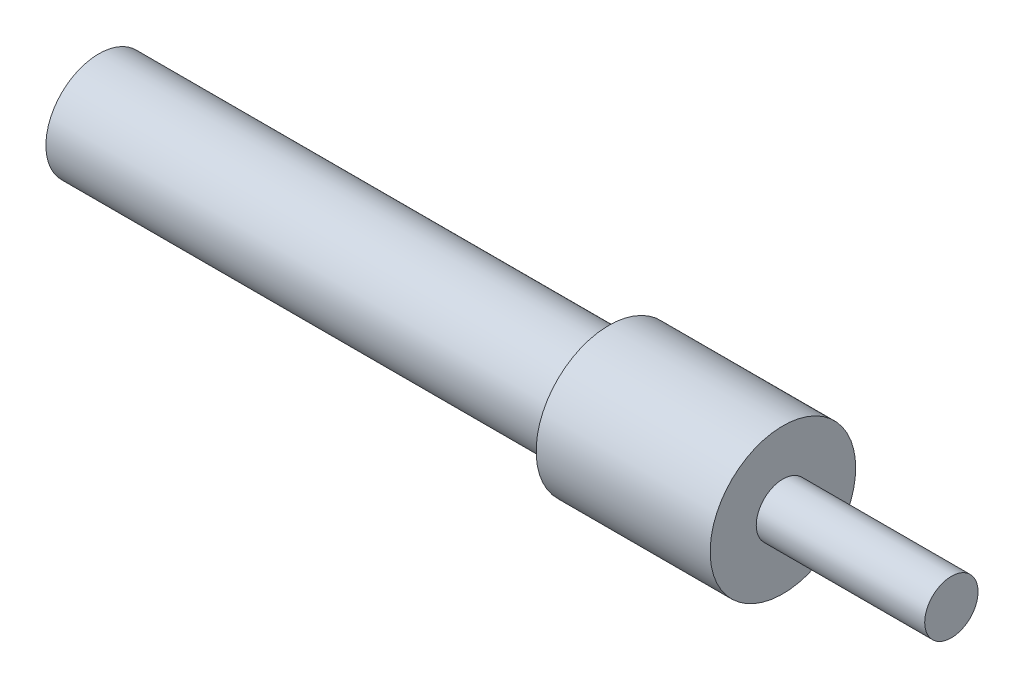
ISO-10303-21;
HEADER;
FILE_DESCRIPTION(('STEP AP214'),'2;1');
FILE_NAME('part.step','',(''),(''),'','','');
FILE_SCHEMA(('AUTOMOTIVE_DESIGN { 1 0 10303 214 1 1 1 1 }'));
ENDSEC;
DATA;
#1=APPLICATION_CONTEXT('core data for automotive mechanical design processes');
#2=APPLICATION_PROTOCOL_DEFINITION('international standard','automotive_design',2000,#1);
#3=PRODUCT_CONTEXT('',#1,'mechanical');
#4=PRODUCT('Part','Part','',(#3));
#5=PRODUCT_RELATED_PRODUCT_CATEGORY('part','',(#4));
#6=PRODUCT_DEFINITION_FORMATION('','',#4);
#7=PRODUCT_DEFINITION_CONTEXT('part definition',#1,'design');
#8=PRODUCT_DEFINITION('design','',#6,#7);
#9=PRODUCT_DEFINITION_SHAPE('','',#8);
#10=(LENGTH_UNIT() NAMED_UNIT(*) SI_UNIT(.MILLI.,.METRE.));
#11=(NAMED_UNIT(*) PLANE_ANGLE_UNIT() SI_UNIT($,.RADIAN.));
#12=(NAMED_UNIT(*) SI_UNIT($,.STERADIAN.) SOLID_ANGLE_UNIT());
#13=UNCERTAINTY_MEASURE_WITH_UNIT(LENGTH_MEASURE(1.E-05),#10,'distance_accuracy_value','');
#14=(GEOMETRIC_REPRESENTATION_CONTEXT(3) GLOBAL_UNCERTAINTY_ASSIGNED_CONTEXT((#13)) GLOBAL_UNIT_ASSIGNED_CONTEXT((#10,
#11,#12)) REPRESENTATION_CONTEXT('',''));
#15=CARTESIAN_POINT('',(0.,0.,0.));
#16=DIRECTION('',(0.,0.,1.));
#17=DIRECTION('',(1.,0.,0.));
#18=AXIS2_PLACEMENT_3D('',#15,#16,#17);
#19=CARTESIAN_POINT('',(15.494,0.,0.));
#20=DIRECTION('',(-1.,0.,0.));
#21=DIRECTION('',(0.,0.,1.));
#22=AXIS2_PLACEMENT_3D('',#19,#20,#21);
#23=CYLINDRICAL_SURFACE('',#22,6.48);
#24=CARTESIAN_POINT('',(15.494,0.,0.));
#25=DIRECTION('',(1.,0.,0.));
#26=DIRECTION('',(0.,0.,-1.));
#27=AXIS2_PLACEMENT_3D('',#24,#25,#26);
#28=CIRCLE('',#27,6.48);
#29=CARTESIAN_POINT('',(15.494,0.,-6.48));
#30=VERTEX_POINT('',#29);
#31=EDGE_CURVE('E10',#30,#30,#28,.T.);
#32=ORIENTED_EDGE('',*,*,#31,.F.);
#33=EDGE_LOOP('',(#32));
#34=FACE_BOUND('',#33,.T.);
#35=CARTESIAN_POINT('',(0.,0.,0.));
#36=DIRECTION('',(1.,0.,0.));
#37=DIRECTION('',(0.,0.,-1.));
#38=AXIS2_PLACEMENT_3D('',#35,#36,#37);
#39=CIRCLE('',#38,6.48);
#40=CARTESIAN_POINT('',(0.,0.,-6.48));
#41=VERTEX_POINT('',#40);
#42=EDGE_CURVE('E44',#41,#41,#39,.T.);
#43=ORIENTED_EDGE('',*,*,#42,.T.);
#44=EDGE_LOOP('',(#43));
#45=FACE_BOUND('',#44,.T.);
#46=ADVANCED_FACE('F37',(#34,#45),#23,.T.);
#47=CARTESIAN_POINT('',(15.494,0.,0.));
#48=DIRECTION('',(1.,0.,0.));
#49=DIRECTION('',(0.,0.,-1.));
#50=AXIS2_PLACEMENT_3D('',#47,#48,#49);
#51=PLANE('',#50);
#52=CARTESIAN_POINT('',(15.494,0.,0.));
#53=DIRECTION('',(-1.,0.,0.));
#54=DIRECTION('',(0.,0.,1.));
#55=AXIS2_PLACEMENT_3D('',#52,#53,#54);
#56=CIRCLE('',#55,2.375);
#57=CARTESIAN_POINT('',(15.494,0.,2.375));
#58=VERTEX_POINT('',#57);
#59=EDGE_CURVE('E54',#58,#58,#56,.T.);
#60=ORIENTED_EDGE('',*,*,#59,.T.);
#61=EDGE_LOOP('',(#60));
#62=FACE_BOUND('',#61,.T.);
#63=ORIENTED_EDGE('',*,*,#31,.T.);
#64=EDGE_LOOP('',(#63));
#65=FACE_BOUND('',#64,.T.);
#66=ADVANCED_FACE('F72',(#62,#65),#51,.T.);
#67=CARTESIAN_POINT('',(0.,0.,0.));
#68=DIRECTION('',(1.,0.,0.));
#69=DIRECTION('',(0.,0.,-1.));
#70=AXIS2_PLACEMENT_3D('',#67,#68,#69);
#71=PLANE('',#70);
#72=CARTESIAN_POINT('',(0.,0.,0.));
#73=DIRECTION('',(1.,0.,0.));
#74=DIRECTION('',(0.,0.,-1.));
#75=AXIS2_PLACEMENT_3D('',#72,#73,#74);
#76=CIRCLE('',#75,4.715);
#77=CARTESIAN_POINT('',(0.,0.,-4.715));
#78=VERTEX_POINT('',#77);
#79=EDGE_CURVE('E40',#78,#78,#76,.T.);
#80=ORIENTED_EDGE('',*,*,#79,.T.);
#81=EDGE_LOOP('',(#80));
#82=FACE_BOUND('',#81,.T.);
#83=ORIENTED_EDGE('',*,*,#42,.F.);
#84=EDGE_LOOP('',(#83));
#85=FACE_BOUND('',#84,.T.);
#86=ADVANCED_FACE('F78',(#82,#85),#71,.F.);
#87=CARTESIAN_POINT('',(-45.416,0.,0.));
#88=DIRECTION('',(1.,0.,0.));
#89=DIRECTION('',(0.,0.,-1.));
#90=AXIS2_PLACEMENT_3D('',#87,#88,#89);
#91=CYLINDRICAL_SURFACE('',#90,4.715);
#92=CARTESIAN_POINT('',(-45.416,0.,0.));
#93=DIRECTION('',(1.,0.,0.));
#94=DIRECTION('',(0.,0.,-1.));
#95=AXIS2_PLACEMENT_3D('',#92,#93,#94);
#96=CIRCLE('',#95,4.715);
#97=CARTESIAN_POINT('',(-45.416,0.,-4.715));
#98=VERTEX_POINT('',#97);
#99=EDGE_CURVE('E50',#98,#98,#96,.T.);
#100=ORIENTED_EDGE('',*,*,#99,.T.);
#101=EDGE_LOOP('',(#100));
#102=FACE_BOUND('',#101,.T.);
#103=ORIENTED_EDGE('',*,*,#79,.F.);
#104=EDGE_LOOP('',(#103));
#105=FACE_BOUND('',#104,.T.);
#106=ADVANCED_FACE('F84',(#102,#105),#91,.T.);
#107=CARTESIAN_POINT('',(-45.416,0.,0.));
#108=DIRECTION('',(1.,0.,0.));
#109=DIRECTION('',(0.,0.,-1.));
#110=AXIS2_PLACEMENT_3D('',#107,#108,#109);
#111=PLANE('',#110);
#112=ORIENTED_EDGE('',*,*,#99,.F.);
#113=EDGE_LOOP('',(#112));
#114=FACE_BOUND('',#113,.T.);
#115=ADVANCED_FACE('F69',(#114),#111,.F.);
#116=CARTESIAN_POINT('',(30.494,0.,0.));
#117=DIRECTION('',(-1.,0.,0.));
#118=DIRECTION('',(0.,0.,1.));
#119=AXIS2_PLACEMENT_3D('',#116,#117,#118);
#120=CYLINDRICAL_SURFACE('',#119,2.375);
#121=CARTESIAN_POINT('',(30.494,0.,0.));
#122=DIRECTION('',(-1.,0.,0.));
#123=DIRECTION('',(0.,0.,1.));
#124=AXIS2_PLACEMENT_3D('',#121,#122,#123);
#125=CIRCLE('',#124,2.375);
#126=CARTESIAN_POINT('',(30.494,0.,2.375));
#127=VERTEX_POINT('',#126);
#128=EDGE_CURVE('E53',#127,#127,#125,.T.);
#129=ORIENTED_EDGE('',*,*,#128,.T.);
#130=EDGE_LOOP('',(#129));
#131=FACE_BOUND('',#130,.T.);
#132=ORIENTED_EDGE('',*,*,#59,.F.);
#133=EDGE_LOOP('',(#132));
#134=FACE_BOUND('',#133,.T.);
#135=ADVANCED_FACE('F60',(#131,#134),#120,.T.);
#136=CARTESIAN_POINT('',(30.494,0.,0.));
#137=DIRECTION('',(-1.,0.,0.));
#138=DIRECTION('',(0.,0.,1.));
#139=AXIS2_PLACEMENT_3D('',#136,#137,#138);
#140=PLANE('',#139);
#141=ORIENTED_EDGE('',*,*,#128,.F.);
#142=EDGE_LOOP('',(#141));
#143=FACE_BOUND('',#142,.T.);
#144=ADVANCED_FACE('F63',(#143),#140,.F.);
#145=CLOSED_SHELL('',(#46,#66,#86,#106,#115,#135,#144));
#146=MANIFOLD_SOLID_BREP('B2',#145);
#147=ADVANCED_BREP_SHAPE_REPRESENTATION('',(#18,#146),#14);
#148=SHAPE_DEFINITION_REPRESENTATION(#9,#147);
ENDSEC;
END-ISO-10303-21;
